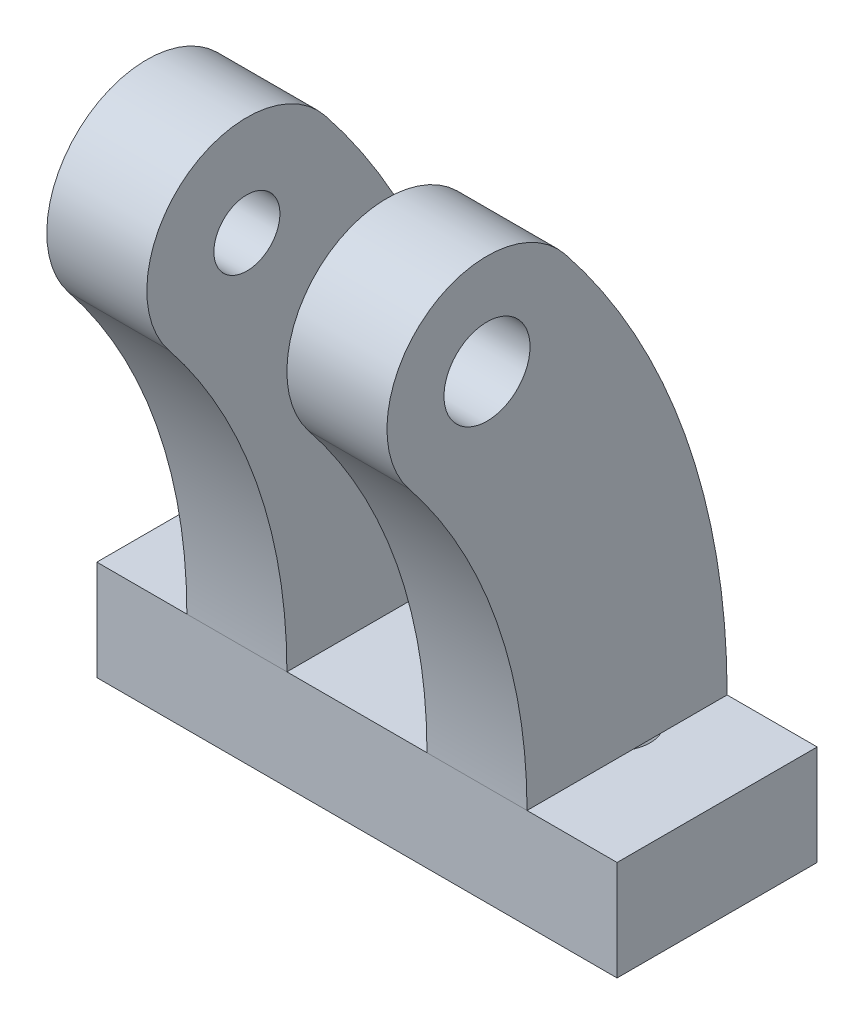
ISO-10303-21;
HEADER;
FILE_DESCRIPTION(('STEP AP214'),'2;1');
FILE_NAME('part.step','',(''),(''),'','','');
FILE_SCHEMA(('AUTOMOTIVE_DESIGN { 1 0 10303 214 1 1 1 1 }'));
ENDSEC;
DATA;
#1=APPLICATION_CONTEXT('core data for automotive mechanical design processes');
#2=APPLICATION_PROTOCOL_DEFINITION('international standard','automotive_design',2000,#1);
#3=PRODUCT_CONTEXT('',#1,'mechanical');
#4=PRODUCT('Part','Part','',(#3));
#5=PRODUCT_RELATED_PRODUCT_CATEGORY('part','',(#4));
#6=PRODUCT_DEFINITION_FORMATION('','',#4);
#7=PRODUCT_DEFINITION_CONTEXT('part definition',#1,'design');
#8=PRODUCT_DEFINITION('design','',#6,#7);
#9=PRODUCT_DEFINITION_SHAPE('','',#8);
#10=(LENGTH_UNIT() NAMED_UNIT(*) SI_UNIT(.MILLI.,.METRE.));
#11=(NAMED_UNIT(*) PLANE_ANGLE_UNIT() SI_UNIT($,.RADIAN.));
#12=(NAMED_UNIT(*) SI_UNIT($,.STERADIAN.) SOLID_ANGLE_UNIT());
#13=UNCERTAINTY_MEASURE_WITH_UNIT(LENGTH_MEASURE(1.E-05),#10,'distance_accuracy_value','');
#14=(GEOMETRIC_REPRESENTATION_CONTEXT(3) GLOBAL_UNCERTAINTY_ASSIGNED_CONTEXT((#13)) GLOBAL_UNIT_ASSIGNED_CONTEXT((#10,
#11,#12)) REPRESENTATION_CONTEXT('',''));
#15=CARTESIAN_POINT('',(0.,0.,0.));
#16=DIRECTION('',(0.,0.,1.));
#17=DIRECTION('',(1.,0.,0.));
#18=AXIS2_PLACEMENT_3D('',#15,#16,#17);
#19=CARTESIAN_POINT('',(0.,5.,0.));
#20=DIRECTION('',(0.,-1.,0.));
#21=DIRECTION('',(0.,0.,-1.));
#22=AXIS2_PLACEMENT_3D('',#19,#20,#21);
#23=PLANE('',#22);
#24=CARTESIAN_POINT('',(7.,5.,-1.));
#25=DIRECTION('',(0.,-1.,0.));
#26=DIRECTION('',(0.,0.,-1.));
#27=AXIS2_PLACEMENT_3D('',#24,#25,#26);
#28=CIRCLE('',#27,1.64999999999999);
#29=CARTESIAN_POINT('',(8.5,5.,-0.312613645756632));
#30=VERTEX_POINT('',#29);
#31=CARTESIAN_POINT('',(8.5,5.,-1.68738635424336));
#32=VERTEX_POINT('',#31);
#33=EDGE_CURVE('E88',#30,#32,#28,.F.);
#34=ORIENTED_EDGE('',*,*,#33,.F.);
#35=DIRECTION('',(0.,0.,-1.));
#36=VECTOR('',#35,1.);
#37=CARTESIAN_POINT('',(8.5,5.,5.));
#38=LINE('',#37,#36);
#39=CARTESIAN_POINT('',(8.49999999999999,5.,5.));
#40=VERTEX_POINT('',#39);
#41=EDGE_CURVE('E290',#40,#30,#38,.T.);
#42=ORIENTED_EDGE('',*,*,#41,.F.);
#43=DIRECTION('',(1.,0.,0.));
#44=VECTOR('',#43,1.);
#45=CARTESIAN_POINT('',(-13.,5.,5.));
#46=LINE('',#45,#44);
#47=CARTESIAN_POINT('',(13.,5.,5.));
#48=VERTEX_POINT('',#47);
#49=EDGE_CURVE('E390',#40,#48,#46,.T.);
#50=ORIENTED_EDGE('',*,*,#49,.T.);
#51=DIRECTION('',(0.,0.,-1.));
#52=VECTOR('',#51,1.);
#53=CARTESIAN_POINT('',(13.,5.,5.));
#54=LINE('',#53,#52);
#55=CARTESIAN_POINT('',(13.,5.,-5.));
#56=VERTEX_POINT('',#55);
#57=EDGE_CURVE('E348',#48,#56,#54,.T.);
#58=ORIENTED_EDGE('',*,*,#57,.T.);
#59=DIRECTION('',(-1.,0.,0.));
#60=VECTOR('',#59,1.);
#61=CARTESIAN_POINT('',(-13.,5.,-5.));
#62=LINE('',#61,#60);
#63=CARTESIAN_POINT('',(8.5,5.,-5.));
#64=VERTEX_POINT('',#63);
#65=EDGE_CURVE('E361',#56,#64,#62,.T.);
#66=ORIENTED_EDGE('',*,*,#65,.T.);
#67=EDGE_CURVE('E298',#32,#64,#38,.T.);
#68=ORIENTED_EDGE('',*,*,#67,.F.);
#69=EDGE_LOOP('',(#34,#42,#50,#58,#66,#68));
#70=FACE_BOUND('',#69,.T.);
#71=ADVANCED_FACE('F55',(#70),#23,.F.);
#72=DIRECTION('',(0.,0.,-1.));
#73=VECTOR('',#72,1.);
#74=CARTESIAN_POINT('',(-3.5,5.,5.));
#75=LINE('',#74,#73);
#76=CARTESIAN_POINT('',(-3.5,5.,5.));
#77=VERTEX_POINT('',#76);
#78=CARTESIAN_POINT('',(-3.5,5.,-5.));
#79=VERTEX_POINT('',#78);
#80=EDGE_CURVE('E268',#77,#79,#75,.T.);
#81=ORIENTED_EDGE('',*,*,#80,.F.);
#82=CARTESIAN_POINT('',(3.49999999999999,5.,5.));
#83=VERTEX_POINT('',#82);
#84=EDGE_CURVE('E392',#77,#83,#46,.T.);
#85=ORIENTED_EDGE('',*,*,#84,.T.);
#86=DIRECTION('',(0.,0.,-1.));
#87=VECTOR('',#86,1.);
#88=CARTESIAN_POINT('',(3.5,5.,5.));
#89=LINE('',#88,#87);
#90=CARTESIAN_POINT('',(3.49999999999999,5.,-5.));
#91=VERTEX_POINT('',#90);
#92=EDGE_CURVE('E335',#83,#91,#89,.T.);
#93=ORIENTED_EDGE('',*,*,#92,.T.);
#94=EDGE_CURVE('E358',#91,#79,#62,.T.);
#95=ORIENTED_EDGE('',*,*,#94,.T.);
#96=EDGE_LOOP('',(#81,#85,#93,#95));
#97=FACE_BOUND('',#96,.T.);
#98=ADVANCED_FACE('F207',(#97),#23,.F.);
#99=CARTESIAN_POINT('',(13.,5.,5.));
#100=DIRECTION('',(-1.,0.,0.));
#101=DIRECTION('',(0.,0.,1.));
#102=AXIS2_PLACEMENT_3D('',#99,#100,#101);
#103=PLANE('',#102);
#104=DIRECTION('',(0.,0.,-1.));
#105=VECTOR('',#104,1.);
#106=CARTESIAN_POINT('',(13.,0.,5.));
#107=LINE('',#106,#105);
#108=CARTESIAN_POINT('',(13.,0.,5.));
#109=VERTEX_POINT('',#108);
#110=CARTESIAN_POINT('',(13.,0.,-5.));
#111=VERTEX_POINT('',#110);
#112=EDGE_CURVE('E331',#109,#111,#107,.T.);
#113=ORIENTED_EDGE('',*,*,#112,.T.);
#114=DIRECTION('',(0.,-1.,0.));
#115=VECTOR('',#114,1.);
#116=CARTESIAN_POINT('',(13.,5.,-5.));
#117=LINE('',#116,#115);
#118=EDGE_CURVE('E69',#56,#111,#117,.T.);
#119=ORIENTED_EDGE('',*,*,#118,.F.);
#120=ORIENTED_EDGE('',*,*,#57,.F.);
#121=DIRECTION('',(0.,-1.,0.));
#122=VECTOR('',#121,1.);
#123=CARTESIAN_POINT('',(13.,5.,5.));
#124=LINE('',#123,#122);
#125=EDGE_CURVE('E374',#48,#109,#124,.T.);
#126=ORIENTED_EDGE('',*,*,#125,.T.);
#127=EDGE_LOOP('',(#113,#119,#120,#126));
#128=FACE_BOUND('',#127,.T.);
#129=ADVANCED_FACE('F57',(#128),#103,.F.);
#130=CARTESIAN_POINT('',(-13.,5.,-5.));
#131=DIRECTION('',(0.,0.,1.));
#132=DIRECTION('',(1.,0.,0.));
#133=AXIS2_PLACEMENT_3D('',#130,#131,#132);
#134=PLANE('',#133);
#135=DIRECTION('',(-1.,0.,0.));
#136=VECTOR('',#135,1.);
#137=CARTESIAN_POINT('',(-13.,0.,-5.));
#138=LINE('',#137,#136);
#139=CARTESIAN_POINT('',(-13.,0.,-5.));
#140=VERTEX_POINT('',#139);
#141=EDGE_CURVE('E383',#111,#140,#138,.T.);
#142=ORIENTED_EDGE('',*,*,#141,.T.);
#143=DIRECTION('',(0.,-1.,0.));
#144=VECTOR('',#143,1.);
#145=CARTESIAN_POINT('',(-13.,5.,-5.));
#146=LINE('',#145,#144);
#147=CARTESIAN_POINT('',(-13.,5.,-5.));
#148=VERTEX_POINT('',#147);
#149=EDGE_CURVE('E366',#148,#140,#146,.T.);
#150=ORIENTED_EDGE('',*,*,#149,.F.);
#151=CARTESIAN_POINT('',(-8.5,5.,-5.));
#152=VERTEX_POINT('',#151);
#153=EDGE_CURVE('E299',#152,#148,#62,.T.);
#154=ORIENTED_EDGE('',*,*,#153,.F.);
#155=DIRECTION('',(1.,0.,0.));
#156=VECTOR('',#155,1.);
#157=CARTESIAN_POINT('',(-8.5,5.,-5.));
#158=LINE('',#157,#156);
#159=EDGE_CURVE('E248',#152,#79,#158,.T.);
#160=ORIENTED_EDGE('',*,*,#159,.T.);
#161=ORIENTED_EDGE('',*,*,#94,.F.);
#162=DIRECTION('',(-1.,0.,0.));
#163=VECTOR('',#162,1.);
#164=CARTESIAN_POINT('',(8.5,5.,-5.));
#165=LINE('',#164,#163);
#166=EDGE_CURVE('E332',#64,#91,#165,.T.);
#167=ORIENTED_EDGE('',*,*,#166,.F.);
#168=ORIENTED_EDGE('',*,*,#65,.F.);
#169=ORIENTED_EDGE('',*,*,#118,.T.);
#170=EDGE_LOOP('',(#142,#150,#154,#160,#161,#167,#168,#169));
#171=FACE_BOUND('',#170,.T.);
#172=ADVANCED_FACE('F526',(#171),#134,.F.);
#173=CARTESIAN_POINT('',(-13.,5.,5.));
#174=DIRECTION('',(1.,0.,0.));
#175=DIRECTION('',(0.,0.,-1.));
#176=AXIS2_PLACEMENT_3D('',#173,#174,#175);
#177=PLANE('',#176);
#178=DIRECTION('',(0.,0.,1.));
#179=VECTOR('',#178,1.);
#180=CARTESIAN_POINT('',(-13.,0.,5.));
#181=LINE('',#180,#179);
#182=CARTESIAN_POINT('',(-13.,0.,5.));
#183=VERTEX_POINT('',#182);
#184=EDGE_CURVE('E380',#140,#183,#181,.T.);
#185=ORIENTED_EDGE('',*,*,#184,.T.);
#186=DIRECTION('',(0.,-1.,0.));
#187=VECTOR('',#186,1.);
#188=CARTESIAN_POINT('',(-13.,5.,5.));
#189=LINE('',#188,#187);
#190=CARTESIAN_POINT('',(-13.,5.,5.));
#191=VERTEX_POINT('',#190);
#192=EDGE_CURVE('E370',#191,#183,#189,.T.);
#193=ORIENTED_EDGE('',*,*,#192,.F.);
#194=DIRECTION('',(0.,0.,1.));
#195=VECTOR('',#194,1.);
#196=CARTESIAN_POINT('',(-13.,5.,5.));
#197=LINE('',#196,#195);
#198=EDGE_CURVE('E353',#148,#191,#197,.T.);
#199=ORIENTED_EDGE('',*,*,#198,.F.);
#200=ORIENTED_EDGE('',*,*,#149,.T.);
#201=EDGE_LOOP('',(#185,#193,#199,#200));
#202=FACE_BOUND('',#201,.T.);
#203=ADVANCED_FACE('F227',(#202),#177,.F.);
#204=CARTESIAN_POINT('',(-13.,5.,5.));
#205=DIRECTION('',(0.,0.,-1.));
#206=DIRECTION('',(-1.,0.,0.));
#207=AXIS2_PLACEMENT_3D('',#204,#205,#206);
#208=PLANE('',#207);
#209=DIRECTION('',(1.,0.,0.));
#210=VECTOR('',#209,1.);
#211=CARTESIAN_POINT('',(-13.,0.,5.));
#212=LINE('',#211,#210);
#213=EDGE_CURVE('E350',#183,#109,#212,.T.);
#214=ORIENTED_EDGE('',*,*,#213,.T.);
#215=ORIENTED_EDGE('',*,*,#125,.F.);
#216=ORIENTED_EDGE('',*,*,#49,.F.);
#217=DIRECTION('',(-1.,0.,0.));
#218=VECTOR('',#217,1.);
#219=CARTESIAN_POINT('',(8.5,5.,5.));
#220=LINE('',#219,#218);
#221=EDGE_CURVE('E327',#40,#83,#220,.T.);
#222=ORIENTED_EDGE('',*,*,#221,.T.);
#223=ORIENTED_EDGE('',*,*,#84,.F.);
#224=DIRECTION('',(1.,0.,0.));
#225=VECTOR('',#224,1.);
#226=CARTESIAN_POINT('',(-8.5,5.,5.));
#227=LINE('',#226,#225);
#228=CARTESIAN_POINT('',(-8.5,5.,5.));
#229=VERTEX_POINT('',#228);
#230=EDGE_CURVE('E242',#229,#77,#227,.T.);
#231=ORIENTED_EDGE('',*,*,#230,.F.);
#232=EDGE_CURVE('E236',#191,#229,#46,.T.);
#233=ORIENTED_EDGE('',*,*,#232,.F.);
#234=ORIENTED_EDGE('',*,*,#192,.T.);
#235=EDGE_LOOP('',(#214,#215,#216,#222,#223,#231,#233,#234));
#236=FACE_BOUND('',#235,.T.);
#237=ADVANCED_FACE('F219',(#236),#208,.F.);
#238=DIRECTION('',(0.,0.,-1.));
#239=VECTOR('',#238,1.);
#240=CARTESIAN_POINT('',(-8.5,5.,5.));
#241=LINE('',#240,#239);
#242=CARTESIAN_POINT('',(-8.5,5.,-0.312613645756629));
#243=VERTEX_POINT('',#242);
#244=EDGE_CURVE('E233',#229,#243,#241,.T.);
#245=ORIENTED_EDGE('',*,*,#244,.T.);
#246=CARTESIAN_POINT('',(-7.,5.,-1.));
#247=DIRECTION('',(0.,-1.,0.));
#248=DIRECTION('',(0.,0.,-1.));
#249=AXIS2_PLACEMENT_3D('',#246,#247,#248);
#250=CIRCLE('',#249,1.65);
#251=CARTESIAN_POINT('',(-8.5,5.,-1.68738635424337));
#252=VERTEX_POINT('',#251);
#253=EDGE_CURVE('E78',#243,#252,#250,.T.);
#254=ORIENTED_EDGE('',*,*,#253,.T.);
#255=EDGE_CURVE('E243',#252,#152,#241,.T.);
#256=ORIENTED_EDGE('',*,*,#255,.T.);
#257=ORIENTED_EDGE('',*,*,#153,.T.);
#258=ORIENTED_EDGE('',*,*,#198,.T.);
#259=ORIENTED_EDGE('',*,*,#232,.T.);
#260=EDGE_LOOP('',(#245,#254,#256,#257,#258,#259));
#261=FACE_BOUND('',#260,.T.);
#262=ADVANCED_FACE('F210',(#261),#23,.F.);
#263=CARTESIAN_POINT('',(0.,0.,0.));
#264=DIRECTION('',(0.,-1.,0.));
#265=DIRECTION('',(0.,0.,-1.));
#266=AXIS2_PLACEMENT_3D('',#263,#264,#265);
#267=PLANE('',#266);
#268=CARTESIAN_POINT('',(-7.,0.,-0.999999999999997));
#269=DIRECTION('',(0.,-1.,0.));
#270=DIRECTION('',(0.,0.,-1.));
#271=AXIS2_PLACEMENT_3D('',#268,#269,#270);
#272=CIRCLE('',#271,1.64999999999999);
#273=CARTESIAN_POINT('',(-7.,0.,-2.64999999999999));
#274=VERTEX_POINT('',#273);
#275=EDGE_CURVE('E426',#274,#274,#272,.T.);
#276=ORIENTED_EDGE('',*,*,#275,.F.);
#277=EDGE_LOOP('',(#276));
#278=FACE_BOUND('',#277,.T.);
#279=CARTESIAN_POINT('',(7.,0.,-0.999999999999997));
#280=DIRECTION('',(0.,-1.,0.));
#281=DIRECTION('',(0.,0.,-1.));
#282=AXIS2_PLACEMENT_3D('',#279,#280,#281);
#283=CIRCLE('',#282,1.64999999999999);
#284=CARTESIAN_POINT('',(7.,0.,-2.64999999999999));
#285=VERTEX_POINT('',#284);
#286=EDGE_CURVE('E437',#285,#285,#283,.T.);
#287=ORIENTED_EDGE('',*,*,#286,.F.);
#288=EDGE_LOOP('',(#287));
#289=FACE_BOUND('',#288,.T.);
#290=ORIENTED_EDGE('',*,*,#112,.F.);
#291=ORIENTED_EDGE('',*,*,#213,.F.);
#292=ORIENTED_EDGE('',*,*,#184,.F.);
#293=ORIENTED_EDGE('',*,*,#141,.F.);
#294=EDGE_LOOP('',(#290,#291,#292,#293));
#295=FACE_BOUND('',#294,.T.);
#296=ADVANCED_FACE('F218',(#278,#289,#295),#267,.T.);
#297=CARTESIAN_POINT('',(8.5,5.,32.0714285714286));
#298=DIRECTION('',(-1.,0.,0.));
#299=DIRECTION('',(0.,0.,1.));
#300=AXIS2_PLACEMENT_3D('',#297,#298,#299);
#301=CYLINDRICAL_SURFACE('',#300,27.0714285714286);
#302=CARTESIAN_POINT('',(3.5,5.,32.0714285714286));
#303=DIRECTION('',(-1.,0.,0.));
#304=DIRECTION('',(0.,0.,-1.));
#305=AXIS2_PLACEMENT_3D('',#302,#303,#304);
#306=CIRCLE('',#305,27.0714285714286);
#307=CARTESIAN_POINT('',(3.5,21.8819599109131,10.9086859688196));
#308=VERTEX_POINT('',#307);
#309=EDGE_CURVE('E282',#308,#83,#306,.T.);
#310=ORIENTED_EDGE('',*,*,#309,.T.);
#311=ORIENTED_EDGE('',*,*,#221,.F.);
#312=CARTESIAN_POINT('',(8.5,5.,32.0714285714286));
#313=DIRECTION('',(-1.,0.,0.));
#314=DIRECTION('',(0.,0.,-1.));
#315=AXIS2_PLACEMENT_3D('',#312,#313,#314);
#316=CIRCLE('',#315,27.0714285714286);
#317=CARTESIAN_POINT('',(8.5,21.8819599109131,10.9086859688196));
#318=VERTEX_POINT('',#317);
#319=EDGE_CURVE('E303',#318,#40,#316,.T.);
#320=ORIENTED_EDGE('',*,*,#319,.F.);
#321=DIRECTION('',(-1.,0.,0.));
#322=VECTOR('',#321,1.);
#323=CARTESIAN_POINT('',(8.5,21.8819599109131,10.9086859688196));
#324=LINE('',#323,#322);
#325=EDGE_CURVE('E341',#318,#308,#324,.T.);
#326=ORIENTED_EDGE('',*,*,#325,.T.);
#327=EDGE_LOOP('',(#310,#311,#320,#326));
#328=FACE_BOUND('',#327,.T.);
#329=ADVANCED_FACE('F225',(#328),#301,.F.);
#330=CARTESIAN_POINT('',(8.5,5.,32.0714285714286));
#331=DIRECTION('',(-1.,0.,0.));
#332=DIRECTION('',(0.,0.,1.));
#333=AXIS2_PLACEMENT_3D('',#330,#331,#332);
#334=CYLINDRICAL_SURFACE('',#333,37.0714285714286);
#335=CARTESIAN_POINT('',(3.5,5.,32.0714285714286));
#336=DIRECTION('',(1.,0.,0.));
#337=DIRECTION('',(0.,0.,-1.));
#338=AXIS2_PLACEMENT_3D('',#335,#336,#337);
#339=CIRCLE('',#338,37.0714285714286);
#340=CARTESIAN_POINT('',(3.5,28.1180400890869,3.09131403118041));
#341=VERTEX_POINT('',#340);
#342=EDGE_CURVE('E319',#91,#341,#339,.T.);
#343=ORIENTED_EDGE('',*,*,#342,.T.);
#344=DIRECTION('',(-1.,0.,0.));
#345=VECTOR('',#344,1.);
#346=CARTESIAN_POINT('',(8.5,28.1180400890869,3.09131403118041));
#347=LINE('',#346,#345);
#348=CARTESIAN_POINT('',(8.5,28.1180400890869,3.09131403118041));
#349=VERTEX_POINT('',#348);
#350=EDGE_CURVE('E344',#349,#341,#347,.T.);
#351=ORIENTED_EDGE('',*,*,#350,.F.);
#352=CARTESIAN_POINT('',(8.5,5.,32.0714285714286));
#353=DIRECTION('',(1.,0.,0.));
#354=DIRECTION('',(0.,0.,-1.));
#355=AXIS2_PLACEMENT_3D('',#352,#353,#354);
#356=CIRCLE('',#355,37.0714285714286);
#357=EDGE_CURVE('E429',#64,#349,#356,.T.);
#358=ORIENTED_EDGE('',*,*,#357,.F.);
#359=ORIENTED_EDGE('',*,*,#166,.T.);
#360=EDGE_LOOP('',(#343,#351,#358,#359));
#361=FACE_BOUND('',#360,.T.);
#362=ADVANCED_FACE('F406',(#361),#334,.T.);
#363=CARTESIAN_POINT('',(8.5,25.,7.));
#364=DIRECTION('',(-1.,0.,0.));
#365=DIRECTION('',(0.,0.,1.));
#366=AXIS2_PLACEMENT_3D('',#363,#364,#365);
#367=CYLINDRICAL_SURFACE('',#366,5.);
#368=CARTESIAN_POINT('',(3.5,25.,7.));
#369=DIRECTION('',(1.,0.,0.));
#370=DIRECTION('',(0.,0.,-1.));
#371=AXIS2_PLACEMENT_3D('',#368,#369,#370);
#372=CIRCLE('',#371,5.);
#373=EDGE_CURVE('E311',#341,#308,#372,.T.);
#374=ORIENTED_EDGE('',*,*,#373,.T.);
#375=ORIENTED_EDGE('',*,*,#325,.F.);
#376=CARTESIAN_POINT('',(8.5,25.,7.));
#377=DIRECTION('',(1.,0.,0.));
#378=DIRECTION('',(0.,0.,-1.));
#379=AXIS2_PLACEMENT_3D('',#376,#377,#378);
#380=CIRCLE('',#379,5.);
#381=EDGE_CURVE('E285',#349,#318,#380,.T.);
#382=ORIENTED_EDGE('',*,*,#381,.F.);
#383=ORIENTED_EDGE('',*,*,#350,.T.);
#384=EDGE_LOOP('',(#374,#375,#382,#383));
#385=FACE_BOUND('',#384,.T.);
#386=ADVANCED_FACE('F414',(#385),#367,.T.);
#387=CARTESIAN_POINT('',(8.5,5.,32.0714285714286));
#388=DIRECTION('',(1.,0.,0.));
#389=DIRECTION('',(0.,0.,-1.));
#390=AXIS2_PLACEMENT_3D('',#387,#388,#389);
#391=PLANE('',#390);
#392=CARTESIAN_POINT('',(8.5,25.,7.));
#393=DIRECTION('',(1.,0.,0.));
#394=DIRECTION('',(0.,0.,-1.));
#395=AXIS2_PLACEMENT_3D('',#392,#393,#394);
#396=CIRCLE('',#395,2.14999999999999);
#397=CARTESIAN_POINT('',(8.5,25.,4.85000000000001));
#398=VERTEX_POINT('',#397);
#399=EDGE_CURVE('E442',#398,#398,#396,.T.);
#400=ORIENTED_EDGE('',*,*,#399,.F.);
#401=EDGE_LOOP('',(#400));
#402=FACE_BOUND('',#401,.T.);
#403=ORIENTED_EDGE('',*,*,#319,.T.);
#404=ORIENTED_EDGE('',*,*,#41,.T.);
#405=EDGE_CURVE('E294',#30,#32,#38,.T.);
#406=ORIENTED_EDGE('',*,*,#405,.T.);
#407=ORIENTED_EDGE('',*,*,#67,.T.);
#408=ORIENTED_EDGE('',*,*,#357,.T.);
#409=ORIENTED_EDGE('',*,*,#381,.T.);
#410=EDGE_LOOP('',(#403,#404,#406,#407,#408,#409));
#411=FACE_BOUND('',#410,.T.);
#412=ADVANCED_FACE('F484',(#402,#411),#391,.T.);
#413=CARTESIAN_POINT('',(3.5,5.,32.0714285714286));
#414=DIRECTION('',(1.,0.,0.));
#415=DIRECTION('',(0.,0.,-1.));
#416=AXIS2_PLACEMENT_3D('',#413,#414,#415);
#417=PLANE('',#416);
#418=CARTESIAN_POINT('',(3.5,25.,7.));
#419=DIRECTION('',(1.,0.,0.));
#420=DIRECTION('',(0.,0.,-1.));
#421=AXIS2_PLACEMENT_3D('',#418,#419,#420);
#422=CIRCLE('',#421,2.14999999999999);
#423=CARTESIAN_POINT('',(3.5,25.,4.85000000000001));
#424=VERTEX_POINT('',#423);
#425=EDGE_CURVE('E260',#424,#424,#422,.F.);
#426=ORIENTED_EDGE('',*,*,#425,.F.);
#427=EDGE_LOOP('',(#426));
#428=FACE_BOUND('',#427,.T.);
#429=ORIENTED_EDGE('',*,*,#309,.F.);
#430=ORIENTED_EDGE('',*,*,#373,.F.);
#431=ORIENTED_EDGE('',*,*,#342,.F.);
#432=ORIENTED_EDGE('',*,*,#92,.F.);
#433=EDGE_LOOP('',(#429,#430,#431,#432));
#434=FACE_BOUND('',#433,.T.);
#435=ADVANCED_FACE('F417',(#428,#434),#417,.F.);
#436=CARTESIAN_POINT('',(-8.5,5.,32.0714285714286));
#437=DIRECTION('',(1.,0.,0.));
#438=DIRECTION('',(0.,0.,-1.));
#439=AXIS2_PLACEMENT_3D('',#436,#437,#438);
#440=CYLINDRICAL_SURFACE('',#439,27.0714285714286);
#441=CARTESIAN_POINT('',(-3.5,5.,32.0714285714286));
#442=DIRECTION('',(-1.,0.,0.));
#443=DIRECTION('',(0.,0.,-1.));
#444=AXIS2_PLACEMENT_3D('',#441,#442,#443);
#445=CIRCLE('',#444,27.0714285714286);
#446=CARTESIAN_POINT('',(-3.5,21.8819599109131,10.9086859688196));
#447=VERTEX_POINT('',#446);
#448=EDGE_CURVE('E255',#447,#77,#445,.T.);
#449=ORIENTED_EDGE('',*,*,#448,.F.);
#450=DIRECTION('',(1.,0.,0.));
#451=VECTOR('',#450,1.);
#452=CARTESIAN_POINT('',(-8.5,21.8819599109131,10.9086859688196));
#453=LINE('',#452,#451);
#454=CARTESIAN_POINT('',(-8.5,21.8819599109131,10.9086859688196));
#455=VERTEX_POINT('',#454);
#456=EDGE_CURVE('E279',#455,#447,#453,.T.);
#457=ORIENTED_EDGE('',*,*,#456,.F.);
#458=CARTESIAN_POINT('',(-8.5,5.,32.0714285714286));
#459=DIRECTION('',(-1.,0.,0.));
#460=DIRECTION('',(0.,0.,-1.));
#461=AXIS2_PLACEMENT_3D('',#458,#459,#460);
#462=CIRCLE('',#461,27.0714285714286);
#463=EDGE_CURVE('E271',#455,#229,#462,.T.);
#464=ORIENTED_EDGE('',*,*,#463,.T.);
#465=ORIENTED_EDGE('',*,*,#230,.T.);
#466=EDGE_LOOP('',(#449,#457,#464,#465));
#467=FACE_BOUND('',#466,.T.);
#468=ADVANCED_FACE('F469',(#467),#440,.F.);
#469=CARTESIAN_POINT('',(-8.5,25.,7.));
#470=DIRECTION('',(1.,0.,0.));
#471=DIRECTION('',(0.,0.,-1.));
#472=AXIS2_PLACEMENT_3D('',#469,#470,#471);
#473=CYLINDRICAL_SURFACE('',#472,5.);
#474=CARTESIAN_POINT('',(-3.5,25.,7.));
#475=DIRECTION('',(1.,0.,0.));
#476=DIRECTION('',(0.,0.,-1.));
#477=AXIS2_PLACEMENT_3D('',#474,#475,#476);
#478=CIRCLE('',#477,5.);
#479=CARTESIAN_POINT('',(-3.5,28.1180400890869,3.09131403118041));
#480=VERTEX_POINT('',#479);
#481=EDGE_CURVE('E259',#480,#447,#478,.T.);
#482=ORIENTED_EDGE('',*,*,#481,.F.);
#483=DIRECTION('',(1.,0.,0.));
#484=VECTOR('',#483,1.);
#485=CARTESIAN_POINT('',(-8.5,28.1180400890869,3.09131403118041));
#486=LINE('',#485,#484);
#487=CARTESIAN_POINT('',(-8.5,28.1180400890869,3.09131403118041));
#488=VERTEX_POINT('',#487);
#489=EDGE_CURVE('E276',#488,#480,#486,.T.);
#490=ORIENTED_EDGE('',*,*,#489,.F.);
#491=CARTESIAN_POINT('',(-8.5,25.,7.));
#492=DIRECTION('',(1.,0.,0.));
#493=DIRECTION('',(0.,0.,-1.));
#494=AXIS2_PLACEMENT_3D('',#491,#492,#493);
#495=CIRCLE('',#494,5.);
#496=EDGE_CURVE('E453',#488,#455,#495,.T.);
#497=ORIENTED_EDGE('',*,*,#496,.T.);
#498=ORIENTED_EDGE('',*,*,#456,.T.);
#499=EDGE_LOOP('',(#482,#490,#497,#498));
#500=FACE_BOUND('',#499,.T.);
#501=ADVANCED_FACE('F470',(#500),#473,.T.);
#502=CARTESIAN_POINT('',(-8.5,5.,32.0714285714286));
#503=DIRECTION('',(1.,0.,0.));
#504=DIRECTION('',(0.,0.,-1.));
#505=AXIS2_PLACEMENT_3D('',#502,#503,#504);
#506=CYLINDRICAL_SURFACE('',#505,37.0714285714286);
#507=CARTESIAN_POINT('',(-3.5,5.,32.0714285714286));
#508=DIRECTION('',(1.,0.,0.));
#509=DIRECTION('',(0.,0.,-1.));
#510=AXIS2_PLACEMENT_3D('',#507,#508,#509);
#511=CIRCLE('',#510,37.0714285714286);
#512=EDGE_CURVE('E264',#79,#480,#511,.T.);
#513=ORIENTED_EDGE('',*,*,#512,.F.);
#514=ORIENTED_EDGE('',*,*,#159,.F.);
#515=CARTESIAN_POINT('',(-8.5,5.,32.0714285714286));
#516=DIRECTION('',(1.,0.,0.));
#517=DIRECTION('',(0.,0.,-1.));
#518=AXIS2_PLACEMENT_3D('',#515,#516,#517);
#519=CIRCLE('',#518,37.0714285714286);
#520=EDGE_CURVE('E251',#152,#488,#519,.T.);
#521=ORIENTED_EDGE('',*,*,#520,.T.);
#522=ORIENTED_EDGE('',*,*,#489,.T.);
#523=EDGE_LOOP('',(#513,#514,#521,#522));
#524=FACE_BOUND('',#523,.T.);
#525=ADVANCED_FACE('F464',(#524),#506,.T.);
#526=CARTESIAN_POINT('',(-8.5,5.,32.0714285714286));
#527=DIRECTION('',(-1.,0.,0.));
#528=DIRECTION('',(0.,0.,-1.));
#529=AXIS2_PLACEMENT_3D('',#526,#527,#528);
#530=PLANE('',#529);
#531=CARTESIAN_POINT('',(-8.5,25.,7.));
#532=DIRECTION('',(-1.,0.,0.));
#533=DIRECTION('',(0.,0.,1.));
#534=AXIS2_PLACEMENT_3D('',#531,#532,#533);
#535=CIRCLE('',#534,1.65);
#536=CARTESIAN_POINT('',(-8.5,25.,8.65));
#537=VERTEX_POINT('',#536);
#538=EDGE_CURVE('E427',#537,#537,#535,.T.);
#539=ORIENTED_EDGE('',*,*,#538,.F.);
#540=EDGE_LOOP('',(#539));
#541=FACE_BOUND('',#540,.T.);
#542=CARTESIAN_POINT('',(-8.5,1.16990683397453,-8.88290049723489));
#543=CARTESIAN_POINT('',(-8.5,1.31736162251309,-8.6330663315507));
#544=CARTESIAN_POINT('',(-8.5,1.46465541489195,-8.3831366727852));
#545=CARTESIAN_POINT('',(-8.5,1.75895809560964,-7.88263643247109));
#546=CARTESIAN_POINT('',(-8.5,1.90596629159066,-7.63206544390892));
#547=CARTESIAN_POINT('',(-8.5,2.20371915548762,-7.12301231609763));
#548=CARTESIAN_POINT('',(-8.5,2.3544436152711,-6.86451834909196));
#549=CARTESIAN_POINT('',(-8.5,2.65465996616655,-6.34730389058686));
#550=CARTESIAN_POINT('',(-8.5,2.80415330033395,-6.08858423808051));
#551=CARTESIAN_POINT('',(-8.5,3.05239428642112,-5.65596735879659));
#552=CARTESIAN_POINT('',(-8.5,3.15157245599781,-5.48231737552767));
#553=CARTESIAN_POINT('',(-8.5,3.34896150471027,-5.13446913231892));
#554=CARTESIAN_POINT('',(-8.5,3.44717238915816,-4.96027087539702));
#555=CARTESIAN_POINT('',(-8.5,3.64270686166793,-4.61023704171206));
#556=CARTESIAN_POINT('',(-8.5,3.74002360620851,-4.4343976307184));
#557=CARTESIAN_POINT('',(-8.5,3.93254740702346,-4.08165883804177));
#558=CARTESIAN_POINT('',(-8.5,4.02775531101048,-3.90475991997118));
#559=CARTESIAN_POINT('',(-8.5,4.21286782538403,-3.5531851477674));
#560=CARTESIAN_POINT('',(-8.5,4.30284321742766,-3.37854697217644));
#561=CARTESIAN_POINT('',(-8.5,4.43396952882998,-3.11448589383151));
#562=CARTESIAN_POINT('',(-8.5,4.47707507174265,-3.02603614144284));
#563=CARTESIAN_POINT('',(-8.5,4.56151876527612,-2.84829938908726));
#564=CARTESIAN_POINT('',(-8.5,4.60285702728657,-2.75901244232154));
#565=CARTESIAN_POINT('',(-8.5,4.68278310337269,-2.58017516227544));
#566=CARTESIAN_POINT('',(-8.5,4.72139237632535,-2.49063448144725));
#567=CARTESIAN_POINT('',(-8.5,4.79538705766873,-2.31018203613248));
#568=CARTESIAN_POINT('',(-8.5,4.83077144756841,-2.21926984898622));
#569=CARTESIAN_POINT('',(-8.5,4.89691180059936,-2.03607806226919));
#570=CARTESIAN_POINT('',(-8.5,4.92768187275689,-1.94380361961163));
#571=CARTESIAN_POINT('',(-8.5,4.98291855186649,-1.757408913372));
#572=CARTESIAN_POINT('',(-8.5,5.00739090677502,-1.66329041792087));
#573=CARTESIAN_POINT('',(-8.5,5.03532117845676,-1.53208350048351));
#574=CARTESIAN_POINT('',(-8.5,5.04240975485115,-1.49575872734569));
#575=CARTESIAN_POINT('',(-8.5,5.05523595606746,-1.42285166406904));
#576=CARTESIAN_POINT('',(-8.5,5.06097295300195,-1.38626926234207));
#577=CARTESIAN_POINT('',(-8.5,5.07097607791354,-1.31291866775674));
#578=CARTESIAN_POINT('',(-8.5,5.07524285498788,-1.27615056417893));
#579=CARTESIAN_POINT('',(-8.5,5.08221872240602,-1.20247141884302));
#580=CARTESIAN_POINT('',(-8.5,5.08492793132159,-1.16556038818084));
#581=CARTESIAN_POINT('',(-8.5,5.09053129559143,-1.0562650842051));
#582=CARTESIAN_POINT('',(-8.5,5.09112000540538,-0.983746381796374));
#583=CARTESIAN_POINT('',(-8.5,5.08599100285161,-0.838900426900369));
#584=CARTESIAN_POINT('',(-8.5,5.08026884837086,-0.766573345233017));
#585=CARTESIAN_POINT('',(-8.5,5.05909242311734,-0.589977638587399));
#586=CARTESIAN_POINT('',(-8.5,5.04040162363667,-0.486097326583591));
#587=CARTESIAN_POINT('',(-8.5,4.99346994910388,-0.280564025622052));
#588=CARTESIAN_POINT('',(-8.5,4.96522318712713,-0.178912450875055));
#589=CARTESIAN_POINT('',(-8.5,4.9010524106971,0.0250973013436946));
#590=CARTESIAN_POINT('',(-8.5,4.86493153139464,0.127392202990599));
#591=CARTESIAN_POINT('',(-8.5,4.80705397595942,0.279383322320124));
#592=CARTESIAN_POINT('',(-8.5,4.78714655252112,0.329802565220123));
#593=CARTESIAN_POINT('',(-8.5,4.7462953256855,0.430218185143512));
#594=CARTESIAN_POINT('',(-8.5,4.72535156396838,0.480214579078808));
#595=CARTESIAN_POINT('',(-8.5,4.65107132446103,0.653356073187393));
#596=CARTESIAN_POINT('',(-8.5,4.59554573385385,0.775560468085513));
#597=CARTESIAN_POINT('',(-8.5,4.4810950605145,1.01837358712969));
#598=CARTESIAN_POINT('',(-8.5,4.42216927343266,1.13898197425617));
#599=CARTESIAN_POINT('',(-8.5,4.30197138862693,1.37910626343128));
#600=CARTESIAN_POINT('',(-8.5,4.2406979657827,1.49862149986977));
#601=CARTESIAN_POINT('',(-8.5,4.11652257707853,1.73680481879393));
#602=CARTESIAN_POINT('',(-8.5,4.05362055066525,1.85547286957039));
#603=CARTESIAN_POINT('',(-8.5,3.92650619117003,2.09241436009953));
#604=CARTESIAN_POINT('',(-8.5,3.8622914557485,2.21068650841808));
#605=CARTESIAN_POINT('',(-8.5,3.73297425075424,2.44674496487658));
#606=CARTESIAN_POINT('',(-8.5,3.66787177323095,2.564531268653));
#607=CARTESIAN_POINT('',(-8.5,3.47160820811513,2.91724655293189));
#608=CARTESIAN_POINT('',(-8.5,3.33944470746915,3.15161735284018));
#609=CARTESIAN_POINT('',(-8.5,3.09435991594562,3.58268780810382));
#610=CARTESIAN_POINT('',(-8.5,2.9816763182237,3.77952317789519));
#611=CARTESIAN_POINT('',(-8.5,2.75546502874945,4.17273604763082));
#612=CARTESIAN_POINT('',(-8.5,2.64193724874059,4.3691134967996));
#613=CARTESIAN_POINT('',(-8.5,2.4147030149582,4.7607911016226));
#614=CARTESIAN_POINT('',(-8.5,2.30099878786349,4.95609255063348));
#615=CARTESIAN_POINT('',(-8.5,2.07314566108168,5.34640584633972));
#616=CARTESIAN_POINT('',(-8.5,1.95899681402705,5.541417723752));
#617=CARTESIAN_POINT('',(-8.5,1.84468855100584,5.73633573922003));
#618=B_SPLINE_CURVE_WITH_KNOTS('',3,(#542,#543,#544,#545,#546,#547,#548,#549,#550,#551,#552,
#553,#554,#555,#556,#557,#558,#559,#560,#561,#562,#563,#564,#565,#566,#567,#568,#569,#570,#571,
#572,#573,#574,#575,#576,#577,#578,#579,#580,#581,#582,#583,#584,#585,#586,#587,#588,#589,#590,
#591,#592,#593,#594,#595,#596,#597,#598,#599,#600,#601,#602,#603,#604,#605,#606,#607,#608,#609,
#610,#611,#612,#613,#614,#615,#616,#617),.UNSPECIFIED.,.F.,.F.,(4,2,2,2,2,2,2,2,2,2,2,2,2,2,2,2,
2,2,2,2,2,2,2,2,2,2,2,2,2,2,2,2,2,2,2,2,2,4),(0.,0.8703109842123,1.74184638126851,
2.63952696835931,3.53593649637284,4.13586398450718,4.7357881761319,5.33869648896566,
5.94135787687626,6.53065649525798,6.82582571110652,7.12097629527489,7.41346268718614,
7.70604113511305,7.99770588988869,8.28910348907944,8.40011261508234,8.51117321004919,
8.62218470911338,8.73318775617251,8.9504476426212,9.16786055236732,9.48386280423515,
9.80006008400196,10.1253214860211,10.287935228463,10.4505424360934,10.8531300319076,
11.2558013251119,11.658703354516,12.0616203858486,12.465355961376,12.8690951551161,
13.6762820379608,14.3567035273786,15.0371971818442,15.715165410904,16.3930556860214),.UNSPECIFIED.);
#619=EDGE_CURVE('E13',#243,#252,#618,.F.);
#620=ORIENTED_EDGE('',*,*,#619,.F.);
#621=ORIENTED_EDGE('',*,*,#244,.F.);
#622=ORIENTED_EDGE('',*,*,#463,.F.);
#623=ORIENTED_EDGE('',*,*,#496,.F.);
#624=ORIENTED_EDGE('',*,*,#520,.F.);
#625=ORIENTED_EDGE('',*,*,#255,.F.);
#626=EDGE_LOOP('',(#620,#621,#622,#623,#624,#625));
#627=FACE_BOUND('',#626,.T.);
#628=ADVANCED_FACE('F466',(#541,#627),#530,.T.);
#629=CARTESIAN_POINT('',(-3.5,5.,32.0714285714286));
#630=DIRECTION('',(-1.,0.,0.));
#631=DIRECTION('',(0.,0.,-1.));
#632=AXIS2_PLACEMENT_3D('',#629,#630,#631);
#633=PLANE('',#632);
#634=CARTESIAN_POINT('',(-3.5,25.,7.));
#635=DIRECTION('',(-1.,0.,0.));
#636=DIRECTION('',(0.,0.,1.));
#637=AXIS2_PLACEMENT_3D('',#634,#635,#636);
#638=CIRCLE('',#637,1.65);
#639=CARTESIAN_POINT('',(-3.5,25.,8.65));
#640=VERTEX_POINT('',#639);
#641=EDGE_CURVE('E423',#640,#640,#638,.T.);
#642=ORIENTED_EDGE('',*,*,#641,.T.);
#643=EDGE_LOOP('',(#642));
#644=FACE_BOUND('',#643,.T.);
#645=ORIENTED_EDGE('',*,*,#448,.T.);
#646=ORIENTED_EDGE('',*,*,#80,.T.);
#647=ORIENTED_EDGE('',*,*,#512,.T.);
#648=ORIENTED_EDGE('',*,*,#481,.T.);
#649=EDGE_LOOP('',(#645,#646,#647,#648));
#650=FACE_BOUND('',#649,.T.);
#651=ADVANCED_FACE('F472',(#644,#650),#633,.F.);
#652=CARTESIAN_POINT('',(8.5,25.,7.));
#653=DIRECTION('',(1.,0.,0.));
#654=DIRECTION('',(0.,0.,-1.));
#655=AXIS2_PLACEMENT_3D('',#652,#653,#654);
#656=CYLINDRICAL_SURFACE('',#655,2.14999999999999);
#657=ORIENTED_EDGE('',*,*,#425,.T.);
#658=EDGE_LOOP('',(#657));
#659=FACE_BOUND('',#658,.T.);
#660=ORIENTED_EDGE('',*,*,#399,.T.);
#661=EDGE_LOOP('',(#660));
#662=FACE_BOUND('',#661,.T.);
#663=ADVANCED_FACE('F498',(#659,#662),#656,.F.);
#664=CARTESIAN_POINT('',(7.,0.,-1.));
#665=DIRECTION('',(0.,-1.,0.));
#666=DIRECTION('',(0.,0.,-1.));
#667=AXIS2_PLACEMENT_3D('',#664,#665,#666);
#668=CYLINDRICAL_SURFACE('',#667,1.64999999999999);
#669=ORIENTED_EDGE('',*,*,#33,.T.);
#670=EDGE_CURVE('E440',#32,#30,#28,.F.);
#671=ORIENTED_EDGE('',*,*,#670,.T.);
#672=EDGE_LOOP('',(#669,#671));
#673=FACE_BOUND('',#672,.T.);
#674=ORIENTED_EDGE('',*,*,#286,.T.);
#675=EDGE_LOOP('',(#674));
#676=FACE_BOUND('',#675,.T.);
#677=ADVANCED_FACE('F202',(#673,#676),#668,.F.);
#678=CARTESIAN_POINT('',(0.,5.,0.));
#679=DIRECTION('',(0.,-1.,0.));
#680=DIRECTION('',(0.,0.,-1.));
#681=AXIS2_PLACEMENT_3D('',#678,#679,#680);
#682=PLANE('',#681);
#683=ORIENTED_EDGE('',*,*,#670,.F.);
#684=ORIENTED_EDGE('',*,*,#405,.F.);
#685=EDGE_LOOP('',(#683,#684));
#686=FACE_BOUND('',#685,.T.);
#687=ADVANCED_FACE('F194',(#686),#682,.T.);
#688=CARTESIAN_POINT('',(-7.,5.,-1.));
#689=DIRECTION('',(0.,-1.,0.));
#690=DIRECTION('',(0.,0.,-1.));
#691=AXIS2_PLACEMENT_3D('',#688,#689,#690);
#692=CONICAL_SURFACE('',#691,1.65,1.02974425867665);
#693=ORIENTED_EDGE('',*,*,#619,.T.);
#694=EDGE_CURVE('E530',#252,#243,#250,.T.);
#695=ORIENTED_EDGE('',*,*,#694,.T.);
#696=EDGE_LOOP('',(#693,#695));
#697=FACE_BOUND('',#696,.T.);
#698=CARTESIAN_POINT('',(-7.,5.99142002139548,-0.999999999999987));
#699=VERTEX_POINT('',#698);
#700=VERTEX_LOOP('',#699);
#701=FACE_BOUND('',#700,.T.);
#702=ADVANCED_FACE('F191',(#697,#701),#692,.F.);
#703=CARTESIAN_POINT('',(-7.,0.,-1.));
#704=DIRECTION('',(0.,-1.,0.));
#705=DIRECTION('',(0.,0.,-1.));
#706=AXIS2_PLACEMENT_3D('',#703,#704,#705);
#707=CYLINDRICAL_SURFACE('',#706,1.64999999999999);
#708=ORIENTED_EDGE('',*,*,#253,.F.);
#709=ORIENTED_EDGE('',*,*,#694,.F.);
#710=EDGE_LOOP('',(#708,#709));
#711=FACE_BOUND('',#710,.T.);
#712=ORIENTED_EDGE('',*,*,#275,.T.);
#713=EDGE_LOOP('',(#712));
#714=FACE_BOUND('',#713,.T.);
#715=ADVANCED_FACE('F193',(#711,#714),#707,.F.);
#716=CARTESIAN_POINT('',(-8.5,25.,7.));
#717=DIRECTION('',(-1.,0.,0.));
#718=DIRECTION('',(0.,0.,1.));
#719=AXIS2_PLACEMENT_3D('',#716,#717,#718);
#720=CYLINDRICAL_SURFACE('',#719,1.65);
#721=ORIENTED_EDGE('',*,*,#641,.F.);
#722=EDGE_LOOP('',(#721));
#723=FACE_BOUND('',#722,.T.);
#724=ORIENTED_EDGE('',*,*,#538,.T.);
#725=EDGE_LOOP('',(#724));
#726=FACE_BOUND('',#725,.T.);
#727=ADVANCED_FACE('F200',(#723,#726),#720,.F.);
#728=CLOSED_SHELL('',(#71,#98,#129,#172,#203,#237,#262,#296,#329,#362,#386,#412,#435,#468,#501,
#525,#628,#651,#663,#677,#687,#702,#715,#727));
#729=MANIFOLD_SOLID_BREP('B2',#728);
#730=ADVANCED_BREP_SHAPE_REPRESENTATION('',(#18,#729),#14);
#731=SHAPE_DEFINITION_REPRESENTATION(#9,#730);
ENDSEC;
END-ISO-10303-21;
